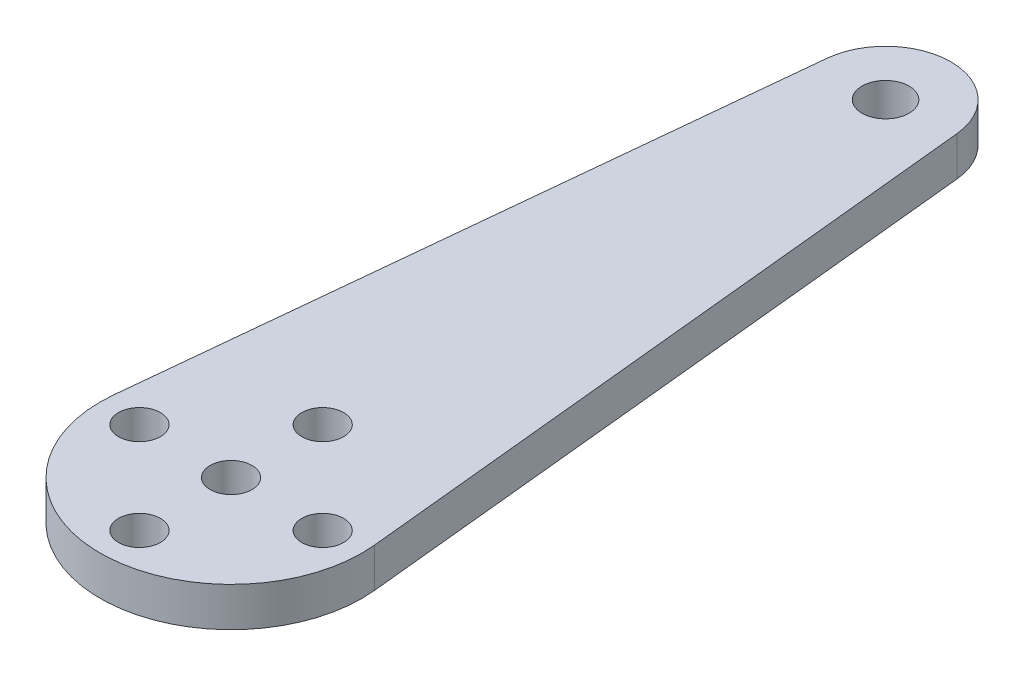
ISO-10303-21;
HEADER;
FILE_DESCRIPTION(('STEP AP214'),'2;1');
FILE_NAME('part.step','',(''),(''),'','','');
FILE_SCHEMA(('AUTOMOTIVE_DESIGN { 1 0 10303 214 1 1 1 1 }'));
ENDSEC;
DATA;
#1=APPLICATION_CONTEXT('core data for automotive mechanical design processes');
#2=APPLICATION_PROTOCOL_DEFINITION('international standard','automotive_design',2000,#1);
#3=PRODUCT_CONTEXT('',#1,'mechanical');
#4=PRODUCT('Part','Part','',(#3));
#5=PRODUCT_RELATED_PRODUCT_CATEGORY('part','',(#4));
#6=PRODUCT_DEFINITION_FORMATION('','',#4);
#7=PRODUCT_DEFINITION_CONTEXT('part definition',#1,'design');
#8=PRODUCT_DEFINITION('design','',#6,#7);
#9=PRODUCT_DEFINITION_SHAPE('','',#8);
#10=(LENGTH_UNIT() NAMED_UNIT(*) SI_UNIT(.MILLI.,.METRE.));
#11=(NAMED_UNIT(*) PLANE_ANGLE_UNIT() SI_UNIT($,.RADIAN.));
#12=(NAMED_UNIT(*) SI_UNIT($,.STERADIAN.) SOLID_ANGLE_UNIT());
#13=UNCERTAINTY_MEASURE_WITH_UNIT(LENGTH_MEASURE(1.E-05),#10,'distance_accuracy_value','');
#14=(GEOMETRIC_REPRESENTATION_CONTEXT(3) GLOBAL_UNCERTAINTY_ASSIGNED_CONTEXT((#13)) GLOBAL_UNIT_ASSIGNED_CONTEXT((#10,
#11,#12)) REPRESENTATION_CONTEXT('',''));
#15=CARTESIAN_POINT('',(0.,0.,0.));
#16=DIRECTION('',(0.,0.,1.));
#17=DIRECTION('',(1.,0.,0.));
#18=AXIS2_PLACEMENT_3D('',#15,#16,#17);
#19=CARTESIAN_POINT('',(0.,3.,-50.));
#20=DIRECTION('',(0.,-1.,0.));
#21=DIRECTION('',(0.,0.,-1.));
#22=AXIS2_PLACEMENT_3D('',#19,#20,#21);
#23=CYLINDRICAL_SURFACE('',#22,5.);
#24=CARTESIAN_POINT('',(0.,0.,-50.));
#25=DIRECTION('',(0.,1.,0.));
#26=DIRECTION('',(0.,0.,1.));
#27=AXIS2_PLACEMENT_3D('',#24,#25,#26);
#28=CIRCLE('',#27,5.);
#29=CARTESIAN_POINT('',(4.9749371855331,0.,-50.5));
#30=VERTEX_POINT('',#29);
#31=CARTESIAN_POINT('',(-4.9749371855331,0.,-50.5));
#32=VERTEX_POINT('',#31);
#33=EDGE_CURVE('E133',#30,#32,#28,.T.);
#34=ORIENTED_EDGE('',*,*,#33,.T.);
#35=DIRECTION('',(0.,-1.,0.));
#36=VECTOR('',#35,1.);
#37=CARTESIAN_POINT('',(-4.9749371855331,3.,-50.5));
#38=LINE('',#37,#36);
#39=CARTESIAN_POINT('',(-4.9749371855331,3.,-50.5));
#40=VERTEX_POINT('',#39);
#41=EDGE_CURVE('E11',#40,#32,#38,.T.);
#42=ORIENTED_EDGE('',*,*,#41,.F.);
#43=CARTESIAN_POINT('',(0.,3.,-50.));
#44=DIRECTION('',(0.,1.,0.));
#45=DIRECTION('',(0.,0.,1.));
#46=AXIS2_PLACEMENT_3D('',#43,#44,#45);
#47=CIRCLE('',#46,5.);
#48=CARTESIAN_POINT('',(4.9749371855331,3.,-50.5));
#49=VERTEX_POINT('',#48);
#50=EDGE_CURVE('E93',#49,#40,#47,.T.);
#51=ORIENTED_EDGE('',*,*,#50,.F.);
#52=DIRECTION('',(0.,-1.,0.));
#53=VECTOR('',#52,1.);
#54=CARTESIAN_POINT('',(4.9749371855331,3.,-50.5));
#55=LINE('',#54,#53);
#56=EDGE_CURVE('E128',#49,#30,#55,.T.);
#57=ORIENTED_EDGE('',*,*,#56,.T.);
#58=EDGE_LOOP('',(#34,#42,#51,#57));
#59=FACE_BOUND('',#58,.T.);
#60=ADVANCED_FACE('F39',(#59),#23,.T.);
#61=CARTESIAN_POINT('',(-9.9498743710662,3.,-1.));
#62=DIRECTION('',(0.99498743710662,0.,0.1));
#63=DIRECTION('',(0.1,0.,-0.99498743710662));
#64=AXIS2_PLACEMENT_3D('',#61,#62,#63);
#65=PLANE('',#64);
#66=DIRECTION('',(-0.1,0.,0.99498743710662));
#67=VECTOR('',#66,1.);
#68=CARTESIAN_POINT('',(-9.9498743710662,0.,-1.));
#69=LINE('',#68,#67);
#70=CARTESIAN_POINT('',(-9.9498743710662,0.,-1.));
#71=VERTEX_POINT('',#70);
#72=EDGE_CURVE('E98',#32,#71,#69,.T.);
#73=ORIENTED_EDGE('',*,*,#72,.T.);
#74=DIRECTION('',(0.,-1.,0.));
#75=VECTOR('',#74,1.);
#76=CARTESIAN_POINT('',(-9.9498743710662,3.,-1.));
#77=LINE('',#76,#75);
#78=CARTESIAN_POINT('',(-9.9498743710662,3.,-1.));
#79=VERTEX_POINT('',#78);
#80=EDGE_CURVE('E49',#79,#71,#77,.T.);
#81=ORIENTED_EDGE('',*,*,#80,.F.);
#82=DIRECTION('',(-0.1,0.,0.99498743710662));
#83=VECTOR('',#82,1.);
#84=CARTESIAN_POINT('',(-9.9498743710662,3.,-1.));
#85=LINE('',#84,#83);
#86=EDGE_CURVE('E87',#40,#79,#85,.T.);
#87=ORIENTED_EDGE('',*,*,#86,.F.);
#88=ORIENTED_EDGE('',*,*,#41,.T.);
#89=EDGE_LOOP('',(#73,#81,#87,#88));
#90=FACE_BOUND('',#89,.T.);
#91=ADVANCED_FACE('F97',(#90),#65,.F.);
#92=CARTESIAN_POINT('',(0.,3.,0.));
#93=DIRECTION('',(0.,-1.,0.));
#94=DIRECTION('',(0.,0.,-1.));
#95=AXIS2_PLACEMENT_3D('',#92,#93,#94);
#96=CYLINDRICAL_SURFACE('',#95,10.);
#97=CARTESIAN_POINT('',(0.,0.,0.));
#98=DIRECTION('',(0.,1.,0.));
#99=DIRECTION('',(0.,0.,1.));
#100=AXIS2_PLACEMENT_3D('',#97,#98,#99);
#101=CIRCLE('',#100,10.);
#102=CARTESIAN_POINT('',(9.9498743710662,0.,-1.));
#103=VERTEX_POINT('',#102);
#104=EDGE_CURVE('E74',#71,#103,#101,.T.);
#105=ORIENTED_EDGE('',*,*,#104,.T.);
#106=DIRECTION('',(0.,-1.,0.));
#107=VECTOR('',#106,1.);
#108=CARTESIAN_POINT('',(9.9498743710662,3.,-1.));
#109=LINE('',#108,#107);
#110=CARTESIAN_POINT('',(9.9498743710662,3.,-1.));
#111=VERTEX_POINT('',#110);
#112=EDGE_CURVE('E100',#111,#103,#109,.T.);
#113=ORIENTED_EDGE('',*,*,#112,.F.);
#114=CARTESIAN_POINT('',(0.,3.,0.));
#115=DIRECTION('',(0.,1.,0.));
#116=DIRECTION('',(0.,0.,1.));
#117=AXIS2_PLACEMENT_3D('',#114,#115,#116);
#118=CIRCLE('',#117,10.);
#119=EDGE_CURVE('E91',#79,#111,#118,.T.);
#120=ORIENTED_EDGE('',*,*,#119,.F.);
#121=ORIENTED_EDGE('',*,*,#80,.T.);
#122=EDGE_LOOP('',(#105,#113,#120,#121));
#123=FACE_BOUND('',#122,.T.);
#124=ADVANCED_FACE('F101',(#123),#96,.T.);
#125=CARTESIAN_POINT('',(0.,3.,7.00000000000001));
#126=DIRECTION('',(0.,-1.,0.));
#127=DIRECTION('',(0.,0.,-1.));
#128=AXIS2_PLACEMENT_3D('',#125,#126,#127);
#129=CYLINDRICAL_SURFACE('',#128,1.6);
#130=CARTESIAN_POINT('',(0.,3.,7.00000000000001));
#131=DIRECTION('',(0.,1.,0.));
#132=DIRECTION('',(0.,0.,1.));
#133=AXIS2_PLACEMENT_3D('',#130,#131,#132);
#134=CIRCLE('',#133,1.6);
#135=CARTESIAN_POINT('',(0.,3.,8.60000000000001));
#136=VERTEX_POINT('',#135);
#137=EDGE_CURVE('E120',#136,#136,#134,.T.);
#138=ORIENTED_EDGE('',*,*,#137,.T.);
#139=EDGE_LOOP('',(#138));
#140=FACE_BOUND('',#139,.T.);
#141=CARTESIAN_POINT('',(0.,0.,7.00000000000001));
#142=DIRECTION('',(0.,1.,0.));
#143=DIRECTION('',(0.,0.,1.));
#144=AXIS2_PLACEMENT_3D('',#141,#142,#143);
#145=CIRCLE('',#144,1.6);
#146=CARTESIAN_POINT('',(0.,0.,8.60000000000001));
#147=VERTEX_POINT('',#146);
#148=EDGE_CURVE('E155',#147,#147,#145,.T.);
#149=ORIENTED_EDGE('',*,*,#148,.F.);
#150=EDGE_LOOP('',(#149));
#151=FACE_BOUND('',#150,.T.);
#152=ADVANCED_FACE('F200',(#140,#151),#129,.F.);
#153=CARTESIAN_POINT('',(0.,3.,0.));
#154=DIRECTION('',(0.,-1.,0.));
#155=DIRECTION('',(0.,0.,-1.));
#156=AXIS2_PLACEMENT_3D('',#153,#154,#155);
#157=CYLINDRICAL_SURFACE('',#156,1.6);
#158=CARTESIAN_POINT('',(0.,3.,0.));
#159=DIRECTION('',(0.,1.,0.));
#160=DIRECTION('',(0.,0.,1.));
#161=AXIS2_PLACEMENT_3D('',#158,#159,#160);
#162=CIRCLE('',#161,1.6);
#163=CARTESIAN_POINT('',(0.,3.,1.6));
#164=VERTEX_POINT('',#163);
#165=EDGE_CURVE('E116',#164,#164,#162,.T.);
#166=ORIENTED_EDGE('',*,*,#165,.T.);
#167=EDGE_LOOP('',(#166));
#168=FACE_BOUND('',#167,.T.);
#169=CARTESIAN_POINT('',(0.,0.,0.));
#170=DIRECTION('',(0.,1.,0.));
#171=DIRECTION('',(0.,0.,1.));
#172=AXIS2_PLACEMENT_3D('',#169,#170,#171);
#173=CIRCLE('',#172,1.6);
#174=CARTESIAN_POINT('',(0.,0.,1.6));
#175=VERTEX_POINT('',#174);
#176=EDGE_CURVE('E151',#175,#175,#173,.T.);
#177=ORIENTED_EDGE('',*,*,#176,.F.);
#178=EDGE_LOOP('',(#177));
#179=FACE_BOUND('',#178,.T.);
#180=ADVANCED_FACE('F210',(#168,#179),#157,.F.);
#181=CARTESIAN_POINT('',(0.,3.,-7.));
#182=DIRECTION('',(0.,-1.,0.));
#183=DIRECTION('',(0.,0.,-1.));
#184=AXIS2_PLACEMENT_3D('',#181,#182,#183);
#185=CYLINDRICAL_SURFACE('',#184,1.6);
#186=CARTESIAN_POINT('',(0.,3.,-7.));
#187=DIRECTION('',(0.,1.,0.));
#188=DIRECTION('',(0.,0.,1.));
#189=AXIS2_PLACEMENT_3D('',#186,#187,#188);
#190=CIRCLE('',#189,1.6);
#191=CARTESIAN_POINT('',(0.,3.,-5.4));
#192=VERTEX_POINT('',#191);
#193=EDGE_CURVE('E112',#192,#192,#190,.T.);
#194=ORIENTED_EDGE('',*,*,#193,.T.);
#195=EDGE_LOOP('',(#194));
#196=FACE_BOUND('',#195,.T.);
#197=CARTESIAN_POINT('',(0.,0.,-7.));
#198=DIRECTION('',(0.,1.,0.));
#199=DIRECTION('',(0.,0.,1.));
#200=AXIS2_PLACEMENT_3D('',#197,#198,#199);
#201=CIRCLE('',#200,1.6);
#202=CARTESIAN_POINT('',(0.,0.,-5.4));
#203=VERTEX_POINT('',#202);
#204=EDGE_CURVE('E147',#203,#203,#201,.T.);
#205=ORIENTED_EDGE('',*,*,#204,.F.);
#206=EDGE_LOOP('',(#205));
#207=FACE_BOUND('',#206,.T.);
#208=ADVANCED_FACE('F206',(#196,#207),#185,.F.);
#209=CARTESIAN_POINT('',(7.,3.,0.));
#210=DIRECTION('',(0.,-1.,0.));
#211=DIRECTION('',(0.,0.,-1.));
#212=AXIS2_PLACEMENT_3D('',#209,#210,#211);
#213=CYLINDRICAL_SURFACE('',#212,1.6);
#214=CARTESIAN_POINT('',(7.,3.,0.));
#215=DIRECTION('',(0.,1.,0.));
#216=DIRECTION('',(0.,0.,1.));
#217=AXIS2_PLACEMENT_3D('',#214,#215,#216);
#218=CIRCLE('',#217,1.6);
#219=CARTESIAN_POINT('',(7.,3.,1.60000000000002));
#220=VERTEX_POINT('',#219);
#221=EDGE_CURVE('E105',#220,#220,#218,.F.);
#222=ORIENTED_EDGE('',*,*,#221,.F.);
#223=EDGE_LOOP('',(#222));
#224=FACE_BOUND('',#223,.T.);
#225=CARTESIAN_POINT('',(7.,0.,0.));
#226=DIRECTION('',(0.,1.,0.));
#227=DIRECTION('',(0.,0.,1.));
#228=AXIS2_PLACEMENT_3D('',#225,#226,#227);
#229=CIRCLE('',#228,1.6);
#230=CARTESIAN_POINT('',(7.,0.,1.60000000000002));
#231=VERTEX_POINT('',#230);
#232=EDGE_CURVE('E143',#231,#231,#229,.F.);
#233=ORIENTED_EDGE('',*,*,#232,.T.);
#234=EDGE_LOOP('',(#233));
#235=FACE_BOUND('',#234,.T.);
#236=ADVANCED_FACE('F203',(#224,#235),#213,.F.);
#237=CARTESIAN_POINT('',(9.9498743710662,3.,-1.));
#238=DIRECTION('',(-0.99498743710662,0.,0.1));
#239=DIRECTION('',(0.1,0.,0.99498743710662));
#240=AXIS2_PLACEMENT_3D('',#237,#238,#239);
#241=PLANE('',#240);
#242=DIRECTION('',(-0.1,0.,-0.99498743710662));
#243=VECTOR('',#242,1.);
#244=CARTESIAN_POINT('',(9.9498743710662,0.,-1.));
#245=LINE('',#244,#243);
#246=EDGE_CURVE('E80',#103,#30,#245,.T.);
#247=ORIENTED_EDGE('',*,*,#246,.T.);
#248=ORIENTED_EDGE('',*,*,#56,.F.);
#249=DIRECTION('',(-0.1,0.,-0.99498743710662));
#250=VECTOR('',#249,1.);
#251=CARTESIAN_POINT('',(9.9498743710662,3.,-1.));
#252=LINE('',#251,#250);
#253=EDGE_CURVE('E57',#111,#49,#252,.T.);
#254=ORIENTED_EDGE('',*,*,#253,.F.);
#255=ORIENTED_EDGE('',*,*,#112,.T.);
#256=EDGE_LOOP('',(#247,#248,#254,#255));
#257=FACE_BOUND('',#256,.T.);
#258=ADVANCED_FACE('F167',(#257),#241,.F.);
#259=CARTESIAN_POINT('',(0.,3.,-50.));
#260=DIRECTION('',(0.,-1.,0.));
#261=DIRECTION('',(0.,0.,-1.));
#262=AXIS2_PLACEMENT_3D('',#259,#260,#261);
#263=CYLINDRICAL_SURFACE('',#262,1.8);
#264=CARTESIAN_POINT('',(0.,3.,-50.));
#265=DIRECTION('',(0.,1.,0.));
#266=DIRECTION('',(0.,0.,1.));
#267=AXIS2_PLACEMENT_3D('',#264,#265,#266);
#268=CIRCLE('',#267,1.8);
#269=CARTESIAN_POINT('',(0.,3.,-48.2));
#270=VERTEX_POINT('',#269);
#271=EDGE_CURVE('E163',#270,#270,#268,.T.);
#272=ORIENTED_EDGE('',*,*,#271,.T.);
#273=EDGE_LOOP('',(#272));
#274=FACE_BOUND('',#273,.T.);
#275=CARTESIAN_POINT('',(0.,0.,-50.));
#276=DIRECTION('',(0.,1.,0.));
#277=DIRECTION('',(0.,0.,1.));
#278=AXIS2_PLACEMENT_3D('',#275,#276,#277);
#279=CIRCLE('',#278,1.8);
#280=CARTESIAN_POINT('',(0.,0.,-48.2));
#281=VERTEX_POINT('',#280);
#282=EDGE_CURVE('E129',#281,#281,#279,.T.);
#283=ORIENTED_EDGE('',*,*,#282,.F.);
#284=EDGE_LOOP('',(#283));
#285=FACE_BOUND('',#284,.T.);
#286=ADVANCED_FACE('F41',(#274,#285),#263,.F.);
#287=CARTESIAN_POINT('',(-7.,3.,0.));
#288=DIRECTION('',(0.,-1.,0.));
#289=DIRECTION('',(0.,0.,-1.));
#290=AXIS2_PLACEMENT_3D('',#287,#288,#289);
#291=CYLINDRICAL_SURFACE('',#290,1.6);
#292=CARTESIAN_POINT('',(-7.,3.,0.));
#293=DIRECTION('',(0.,1.,0.));
#294=DIRECTION('',(0.,0.,1.));
#295=AXIS2_PLACEMENT_3D('',#292,#293,#294);
#296=CIRCLE('',#295,1.6);
#297=CARTESIAN_POINT('',(-7.,3.,1.59999999999993));
#298=VERTEX_POINT('',#297);
#299=EDGE_CURVE('E124',#298,#298,#296,.F.);
#300=ORIENTED_EDGE('',*,*,#299,.F.);
#301=EDGE_LOOP('',(#300));
#302=FACE_BOUND('',#301,.T.);
#303=CARTESIAN_POINT('',(-7.,0.,0.));
#304=DIRECTION('',(0.,1.,0.));
#305=DIRECTION('',(0.,0.,1.));
#306=AXIS2_PLACEMENT_3D('',#303,#304,#305);
#307=CIRCLE('',#306,1.6);
#308=CARTESIAN_POINT('',(-7.,0.,1.59999999999993));
#309=VERTEX_POINT('',#308);
#310=EDGE_CURVE('E159',#309,#309,#307,.F.);
#311=ORIENTED_EDGE('',*,*,#310,.T.);
#312=EDGE_LOOP('',(#311));
#313=FACE_BOUND('',#312,.T.);
#314=ADVANCED_FACE('F182',(#302,#313),#291,.F.);
#315=CARTESIAN_POINT('',(0.,3.,0.));
#316=DIRECTION('',(0.,1.,0.));
#317=DIRECTION('',(0.,0.,1.));
#318=AXIS2_PLACEMENT_3D('',#315,#316,#317);
#319=PLANE('',#318);
#320=ORIENTED_EDGE('',*,*,#271,.F.);
#321=EDGE_LOOP('',(#320));
#322=FACE_BOUND('',#321,.T.);
#323=ORIENTED_EDGE('',*,*,#50,.T.);
#324=ORIENTED_EDGE('',*,*,#86,.T.);
#325=ORIENTED_EDGE('',*,*,#119,.T.);
#326=ORIENTED_EDGE('',*,*,#253,.T.);
#327=EDGE_LOOP('',(#323,#324,#325,#326));
#328=FACE_BOUND('',#327,.T.);
#329=ORIENTED_EDGE('',*,*,#221,.T.);
#330=EDGE_LOOP('',(#329));
#331=FACE_BOUND('',#330,.T.);
#332=ORIENTED_EDGE('',*,*,#193,.F.);
#333=EDGE_LOOP('',(#332));
#334=FACE_BOUND('',#333,.T.);
#335=ORIENTED_EDGE('',*,*,#165,.F.);
#336=EDGE_LOOP('',(#335));
#337=FACE_BOUND('',#336,.T.);
#338=ORIENTED_EDGE('',*,*,#137,.F.);
#339=EDGE_LOOP('',(#338));
#340=FACE_BOUND('',#339,.T.);
#341=ORIENTED_EDGE('',*,*,#299,.T.);
#342=EDGE_LOOP('',(#341));
#343=FACE_BOUND('',#342,.T.);
#344=ADVANCED_FACE('F88',(#322,#328,#331,#334,#337,#340,#343),#319,.T.);
#345=CARTESIAN_POINT('',(0.,0.,0.));
#346=DIRECTION('',(0.,1.,0.));
#347=DIRECTION('',(0.,0.,1.));
#348=AXIS2_PLACEMENT_3D('',#345,#346,#347);
#349=PLANE('',#348);
#350=ORIENTED_EDGE('',*,*,#282,.T.);
#351=EDGE_LOOP('',(#350));
#352=FACE_BOUND('',#351,.T.);
#353=ORIENTED_EDGE('',*,*,#33,.F.);
#354=ORIENTED_EDGE('',*,*,#246,.F.);
#355=ORIENTED_EDGE('',*,*,#104,.F.);
#356=ORIENTED_EDGE('',*,*,#72,.F.);
#357=EDGE_LOOP('',(#353,#354,#355,#356));
#358=FACE_BOUND('',#357,.T.);
#359=ORIENTED_EDGE('',*,*,#232,.F.);
#360=EDGE_LOOP('',(#359));
#361=FACE_BOUND('',#360,.T.);
#362=ORIENTED_EDGE('',*,*,#204,.T.);
#363=EDGE_LOOP('',(#362));
#364=FACE_BOUND('',#363,.T.);
#365=ORIENTED_EDGE('',*,*,#176,.T.);
#366=EDGE_LOOP('',(#365));
#367=FACE_BOUND('',#366,.T.);
#368=ORIENTED_EDGE('',*,*,#148,.T.);
#369=EDGE_LOOP('',(#368));
#370=FACE_BOUND('',#369,.T.);
#371=ORIENTED_EDGE('',*,*,#310,.F.);
#372=EDGE_LOOP('',(#371));
#373=FACE_BOUND('',#372,.T.);
#374=ADVANCED_FACE('F170',(#352,#358,#361,#364,#367,#370,#373),#349,.F.);
#375=CLOSED_SHELL('',(#60,#91,#124,#152,#180,#208,#236,#258,#286,#314,#344,#374));
#376=MANIFOLD_SOLID_BREP('B2',#375);
#377=ADVANCED_BREP_SHAPE_REPRESENTATION('',(#18,#376),#14);
#378=SHAPE_DEFINITION_REPRESENTATION(#9,#377);
ENDSEC;
END-ISO-10303-21;
